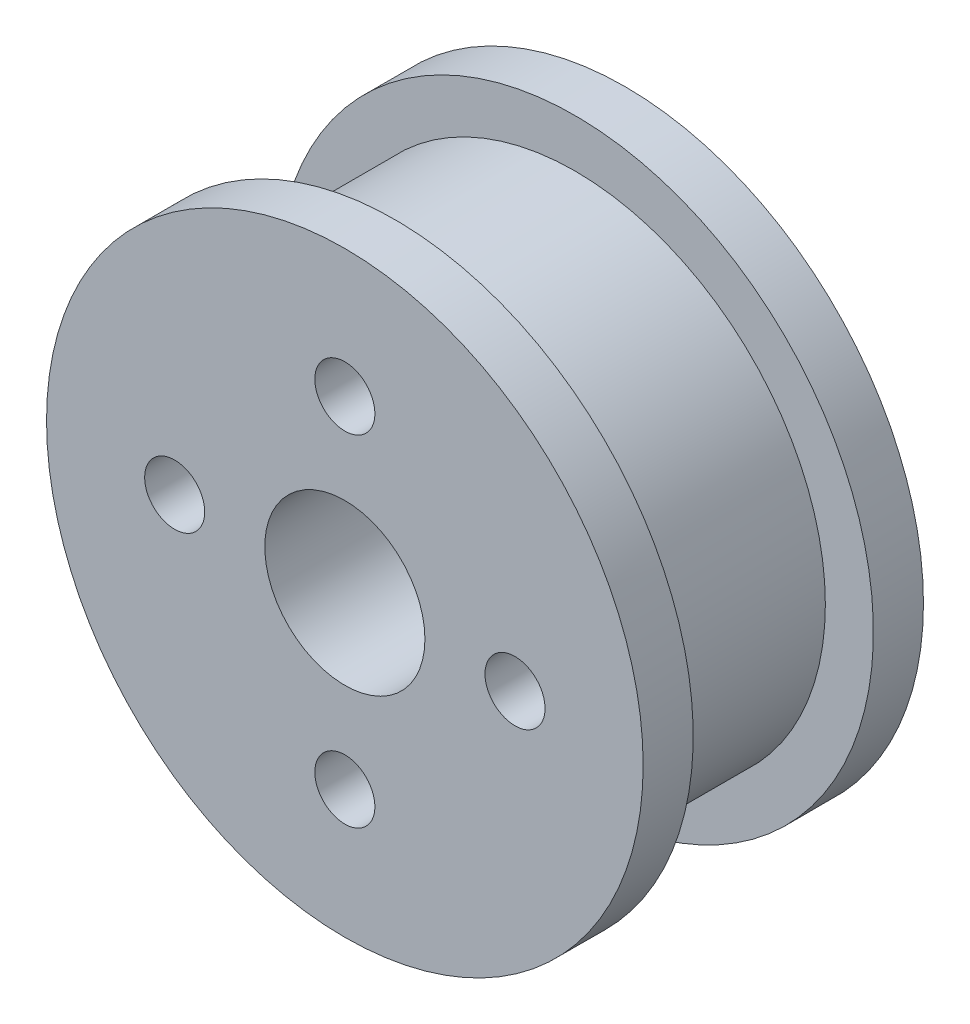
ISO-10303-21;
HEADER;
FILE_DESCRIPTION(('STEP AP214'),'2;1');
FILE_NAME('part.step','',(''),(''),'','','');
FILE_SCHEMA(('AUTOMOTIVE_DESIGN { 1 0 10303 214 1 1 1 1 }'));
ENDSEC;
DATA;
#1=APPLICATION_CONTEXT('core data for automotive mechanical design processes');
#2=APPLICATION_PROTOCOL_DEFINITION('international standard','automotive_design',2000,#1);
#3=PRODUCT_CONTEXT('',#1,'mechanical');
#4=PRODUCT('Part','Part','',(#3));
#5=PRODUCT_RELATED_PRODUCT_CATEGORY('part','',(#4));
#6=PRODUCT_DEFINITION_FORMATION('','',#4);
#7=PRODUCT_DEFINITION_CONTEXT('part definition',#1,'design');
#8=PRODUCT_DEFINITION('design','',#6,#7);
#9=PRODUCT_DEFINITION_SHAPE('','',#8);
#10=(LENGTH_UNIT() NAMED_UNIT(*) SI_UNIT(.MILLI.,.METRE.));
#11=(NAMED_UNIT(*) PLANE_ANGLE_UNIT() SI_UNIT($,.RADIAN.));
#12=(NAMED_UNIT(*) SI_UNIT($,.STERADIAN.) SOLID_ANGLE_UNIT());
#13=UNCERTAINTY_MEASURE_WITH_UNIT(LENGTH_MEASURE(1.E-05),#10,'distance_accuracy_value','');
#14=(GEOMETRIC_REPRESENTATION_CONTEXT(3) GLOBAL_UNCERTAINTY_ASSIGNED_CONTEXT((#13)) GLOBAL_UNIT_ASSIGNED_CONTEXT((#10,
#11,#12)) REPRESENTATION_CONTEXT('',''));
#15=CARTESIAN_POINT('',(0.,0.,0.));
#16=DIRECTION('',(0.,0.,1.));
#17=DIRECTION('',(1.,0.,0.));
#18=AXIS2_PLACEMENT_3D('',#15,#16,#17);
#19=CARTESIAN_POINT('',(0.,0.,14.));
#20=DIRECTION('',(0.,0.,-1.));
#21=DIRECTION('',(-1.,0.,0.));
#22=AXIS2_PLACEMENT_3D('',#19,#20,#21);
#23=CYLINDRICAL_SURFACE('',#22,14.9);
#24=CARTESIAN_POINT('',(0.,0.,14.));
#25=DIRECTION('',(0.,0.,1.));
#26=DIRECTION('',(1.,0.,0.));
#27=AXIS2_PLACEMENT_3D('',#24,#25,#26);
#28=CIRCLE('',#27,14.9);
#29=CARTESIAN_POINT('',(14.9,0.,14.));
#30=VERTEX_POINT('',#29);
#31=EDGE_CURVE('E10',#30,#30,#28,.T.);
#32=ORIENTED_EDGE('',*,*,#31,.F.);
#33=EDGE_LOOP('',(#32));
#34=FACE_BOUND('',#33,.T.);
#35=CARTESIAN_POINT('',(0.,0.,11.5));
#36=DIRECTION('',(0.,0.,-1.));
#37=DIRECTION('',(-1.,0.,0.));
#38=AXIS2_PLACEMENT_3D('',#35,#36,#37);
#39=CIRCLE('',#38,14.9);
#40=CARTESIAN_POINT('',(-14.9,0.,11.5));
#41=VERTEX_POINT('',#40);
#42=EDGE_CURVE('E53',#41,#41,#39,.T.);
#43=ORIENTED_EDGE('',*,*,#42,.F.);
#44=EDGE_LOOP('',(#43));
#45=FACE_BOUND('',#44,.T.);
#46=ADVANCED_FACE('F37',(#34,#45),#23,.T.);
#47=CARTESIAN_POINT('',(0.,0.,14.));
#48=DIRECTION('',(0.,0.,1.));
#49=DIRECTION('',(1.,0.,0.));
#50=AXIS2_PLACEMENT_3D('',#47,#48,#49);
#51=PLANE('',#50);
#52=CARTESIAN_POINT('',(0.,8.5,14.));
#53=DIRECTION('',(0.,0.,-1.));
#54=DIRECTION('',(-1.,0.,0.));
#55=AXIS2_PLACEMENT_3D('',#52,#53,#54);
#56=CIRCLE('',#55,1.5);
#57=CARTESIAN_POINT('',(-1.5,8.5,14.));
#58=VERTEX_POINT('',#57);
#59=EDGE_CURVE('E65',#58,#58,#56,.T.);
#60=ORIENTED_EDGE('',*,*,#59,.T.);
#61=EDGE_LOOP('',(#60));
#62=FACE_BOUND('',#61,.T.);
#63=CARTESIAN_POINT('',(8.5,0.,14.));
#64=DIRECTION('',(0.,0.,-1.));
#65=DIRECTION('',(-1.,0.,0.));
#66=AXIS2_PLACEMENT_3D('',#63,#64,#65);
#67=CIRCLE('',#66,1.5);
#68=CARTESIAN_POINT('',(7.,0.,14.));
#69=VERTEX_POINT('',#68);
#70=EDGE_CURVE('E83',#69,#69,#67,.T.);
#71=ORIENTED_EDGE('',*,*,#70,.T.);
#72=EDGE_LOOP('',(#71));
#73=FACE_BOUND('',#72,.T.);
#74=CARTESIAN_POINT('',(-8.5,0.,14.));
#75=DIRECTION('',(0.,0.,-1.));
#76=DIRECTION('',(-1.,0.,0.));
#77=AXIS2_PLACEMENT_3D('',#74,#75,#76);
#78=CIRCLE('',#77,1.5);
#79=CARTESIAN_POINT('',(-10.,0.,14.));
#80=VERTEX_POINT('',#79);
#81=EDGE_CURVE('E77',#80,#80,#78,.T.);
#82=ORIENTED_EDGE('',*,*,#81,.T.);
#83=EDGE_LOOP('',(#82));
#84=FACE_BOUND('',#83,.T.);
#85=CARTESIAN_POINT('',(0.,-8.5,14.));
#86=DIRECTION('',(0.,0.,-1.));
#87=DIRECTION('',(-1.,0.,0.));
#88=AXIS2_PLACEMENT_3D('',#85,#86,#87);
#89=CIRCLE('',#88,1.5);
#90=CARTESIAN_POINT('',(-1.5,-8.5,14.));
#91=VERTEX_POINT('',#90);
#92=EDGE_CURVE('E71',#91,#91,#89,.T.);
#93=ORIENTED_EDGE('',*,*,#92,.T.);
#94=EDGE_LOOP('',(#93));
#95=FACE_BOUND('',#94,.T.);
#96=ORIENTED_EDGE('',*,*,#31,.T.);
#97=EDGE_LOOP('',(#96));
#98=FACE_BOUND('',#97,.T.);
#99=CARTESIAN_POINT('',(0.,0.,14.));
#100=DIRECTION('',(0.,0.,1.));
#101=DIRECTION('',(1.,0.,0.));
#102=AXIS2_PLACEMENT_3D('',#99,#100,#101);
#103=CIRCLE('',#102,4.);
#104=CARTESIAN_POINT('',(4.,0.,14.));
#105=VERTEX_POINT('',#104);
#106=EDGE_CURVE('E48',#105,#105,#103,.T.);
#107=ORIENTED_EDGE('',*,*,#106,.F.);
#108=EDGE_LOOP('',(#107));
#109=FACE_BOUND('',#108,.T.);
#110=ADVANCED_FACE('F92',(#62,#73,#84,#95,#98,#109),#51,.T.);
#111=CARTESIAN_POINT('',(0.,0.,0.));
#112=DIRECTION('',(0.,0.,1.));
#113=DIRECTION('',(1.,0.,0.));
#114=AXIS2_PLACEMENT_3D('',#111,#112,#113);
#115=PLANE('',#114);
#116=CARTESIAN_POINT('',(0.,8.5,0.));
#117=DIRECTION('',(0.,0.,-1.));
#118=DIRECTION('',(-1.,0.,0.));
#119=AXIS2_PLACEMENT_3D('',#116,#117,#118);
#120=CIRCLE('',#119,1.5);
#121=CARTESIAN_POINT('',(-1.5,8.5,0.));
#122=VERTEX_POINT('',#121);
#123=EDGE_CURVE('E86',#122,#122,#120,.T.);
#124=ORIENTED_EDGE('',*,*,#123,.F.);
#125=EDGE_LOOP('',(#124));
#126=FACE_BOUND('',#125,.T.);
#127=CARTESIAN_POINT('',(8.5,0.,0.));
#128=DIRECTION('',(0.,0.,-1.));
#129=DIRECTION('',(-1.,0.,0.));
#130=AXIS2_PLACEMENT_3D('',#127,#128,#129);
#131=CIRCLE('',#130,1.5);
#132=CARTESIAN_POINT('',(7.,0.,0.));
#133=VERTEX_POINT('',#132);
#134=EDGE_CURVE('E80',#133,#133,#131,.T.);
#135=ORIENTED_EDGE('',*,*,#134,.F.);
#136=EDGE_LOOP('',(#135));
#137=FACE_BOUND('',#136,.T.);
#138=CARTESIAN_POINT('',(-8.5,0.,0.));
#139=DIRECTION('',(0.,0.,-1.));
#140=DIRECTION('',(-1.,0.,0.));
#141=AXIS2_PLACEMENT_3D('',#138,#139,#140);
#142=CIRCLE('',#141,1.5);
#143=CARTESIAN_POINT('',(-10.,0.,0.));
#144=VERTEX_POINT('',#143);
#145=EDGE_CURVE('E74',#144,#144,#142,.T.);
#146=ORIENTED_EDGE('',*,*,#145,.F.);
#147=EDGE_LOOP('',(#146));
#148=FACE_BOUND('',#147,.T.);
#149=CARTESIAN_POINT('',(0.,-8.5,0.));
#150=DIRECTION('',(0.,0.,-1.));
#151=DIRECTION('',(-1.,0.,0.));
#152=AXIS2_PLACEMENT_3D('',#149,#150,#151);
#153=CIRCLE('',#152,1.5);
#154=CARTESIAN_POINT('',(-1.5,-8.5,0.));
#155=VERTEX_POINT('',#154);
#156=EDGE_CURVE('E68',#155,#155,#153,.T.);
#157=ORIENTED_EDGE('',*,*,#156,.F.);
#158=EDGE_LOOP('',(#157));
#159=FACE_BOUND('',#158,.T.);
#160=CARTESIAN_POINT('',(0.,0.,0.));
#161=DIRECTION('',(0.,0.,1.));
#162=DIRECTION('',(1.,0.,0.));
#163=AXIS2_PLACEMENT_3D('',#160,#161,#162);
#164=CIRCLE('',#163,14.9);
#165=CARTESIAN_POINT('',(14.9,0.,0.));
#166=VERTEX_POINT('',#165);
#167=EDGE_CURVE('E41',#166,#166,#164,.T.);
#168=ORIENTED_EDGE('',*,*,#167,.F.);
#169=EDGE_LOOP('',(#168));
#170=FACE_BOUND('',#169,.T.);
#171=CARTESIAN_POINT('',(0.,0.,0.));
#172=DIRECTION('',(0.,0.,1.));
#173=DIRECTION('',(1.,0.,0.));
#174=AXIS2_PLACEMENT_3D('',#171,#172,#173);
#175=CIRCLE('',#174,4.);
#176=CARTESIAN_POINT('',(4.,0.,0.));
#177=VERTEX_POINT('',#176);
#178=EDGE_CURVE('E50',#177,#177,#175,.T.);
#179=ORIENTED_EDGE('',*,*,#178,.T.);
#180=EDGE_LOOP('',(#179));
#181=FACE_BOUND('',#180,.T.);
#182=ADVANCED_FACE('F102',(#126,#137,#148,#159,#170,#181),#115,.F.);
#183=CARTESIAN_POINT('',(0.,0.,2.5));
#184=DIRECTION('',(0.,0.,-1.));
#185=DIRECTION('',(-1.,0.,0.));
#186=AXIS2_PLACEMENT_3D('',#183,#184,#185);
#187=CIRCLE('',#186,14.9);
#188=CARTESIAN_POINT('',(-14.9,0.,2.5));
#189=VERTEX_POINT('',#188);
#190=EDGE_CURVE('E56',#189,#189,#187,.T.);
#191=ORIENTED_EDGE('',*,*,#190,.T.);
#192=EDGE_LOOP('',(#191));
#193=FACE_BOUND('',#192,.T.);
#194=ORIENTED_EDGE('',*,*,#167,.T.);
#195=EDGE_LOOP('',(#194));
#196=FACE_BOUND('',#195,.T.);
#197=ADVANCED_FACE('F39',(#193,#196),#23,.T.);
#198=CARTESIAN_POINT('',(0.,0.,14.));
#199=DIRECTION('',(0.,0.,-1.));
#200=DIRECTION('',(-1.,0.,0.));
#201=AXIS2_PLACEMENT_3D('',#198,#199,#200);
#202=CYLINDRICAL_SURFACE('',#201,4.);
#203=ORIENTED_EDGE('',*,*,#106,.T.);
#204=EDGE_LOOP('',(#203));
#205=FACE_BOUND('',#204,.T.);
#206=ORIENTED_EDGE('',*,*,#178,.F.);
#207=EDGE_LOOP('',(#206));
#208=FACE_BOUND('',#207,.T.);
#209=ADVANCED_FACE('F115',(#205,#208),#202,.F.);
#210=CARTESIAN_POINT('',(0.,0.,11.5));
#211=DIRECTION('',(0.,0.,-1.));
#212=DIRECTION('',(-1.,0.,0.));
#213=AXIS2_PLACEMENT_3D('',#210,#211,#212);
#214=PLANE('',#213);
#215=CARTESIAN_POINT('',(0.,0.,11.5));
#216=DIRECTION('',(0.,0.,-1.));
#217=DIRECTION('',(-1.,0.,0.));
#218=AXIS2_PLACEMENT_3D('',#215,#216,#217);
#219=CIRCLE('',#218,12.5);
#220=CARTESIAN_POINT('',(-12.5,0.,11.5));
#221=VERTEX_POINT('',#220);
#222=EDGE_CURVE('E59',#221,#221,#219,.T.);
#223=ORIENTED_EDGE('',*,*,#222,.F.);
#224=EDGE_LOOP('',(#223));
#225=FACE_BOUND('',#224,.T.);
#226=ORIENTED_EDGE('',*,*,#42,.T.);
#227=EDGE_LOOP('',(#226));
#228=FACE_BOUND('',#227,.T.);
#229=ADVANCED_FACE('F117',(#225,#228),#214,.T.);
#230=CARTESIAN_POINT('',(0.,0.,2.5));
#231=DIRECTION('',(0.,0.,-1.));
#232=DIRECTION('',(-1.,0.,0.));
#233=AXIS2_PLACEMENT_3D('',#230,#231,#232);
#234=PLANE('',#233);
#235=CARTESIAN_POINT('',(0.,0.,2.5));
#236=DIRECTION('',(0.,0.,-1.));
#237=DIRECTION('',(-1.,0.,0.));
#238=AXIS2_PLACEMENT_3D('',#235,#236,#237);
#239=CIRCLE('',#238,12.5);
#240=CARTESIAN_POINT('',(-12.5,0.,2.5));
#241=VERTEX_POINT('',#240);
#242=EDGE_CURVE('E62',#241,#241,#239,.T.);
#243=ORIENTED_EDGE('',*,*,#242,.T.);
#244=EDGE_LOOP('',(#243));
#245=FACE_BOUND('',#244,.T.);
#246=ORIENTED_EDGE('',*,*,#190,.F.);
#247=EDGE_LOOP('',(#246));
#248=FACE_BOUND('',#247,.T.);
#249=ADVANCED_FACE('F124',(#245,#248),#234,.F.);
#250=CARTESIAN_POINT('',(0.,0.,11.5));
#251=DIRECTION('',(0.,0.,-1.));
#252=DIRECTION('',(-1.,0.,0.));
#253=AXIS2_PLACEMENT_3D('',#250,#251,#252);
#254=CYLINDRICAL_SURFACE('',#253,12.5);
#255=ORIENTED_EDGE('',*,*,#222,.T.);
#256=EDGE_LOOP('',(#255));
#257=FACE_BOUND('',#256,.T.);
#258=ORIENTED_EDGE('',*,*,#242,.F.);
#259=EDGE_LOOP('',(#258));
#260=FACE_BOUND('',#259,.T.);
#261=ADVANCED_FACE('F168',(#257,#260),#254,.T.);
#262=CARTESIAN_POINT('',(0.,-8.5,14.));
#263=DIRECTION('',(0.,0.,-1.));
#264=DIRECTION('',(-1.,0.,0.));
#265=AXIS2_PLACEMENT_3D('',#262,#263,#264);
#266=CYLINDRICAL_SURFACE('',#265,1.5);
#267=ORIENTED_EDGE('',*,*,#92,.F.);
#268=EDGE_LOOP('',(#267));
#269=FACE_BOUND('',#268,.T.);
#270=ORIENTED_EDGE('',*,*,#156,.T.);
#271=EDGE_LOOP('',(#270));
#272=FACE_BOUND('',#271,.T.);
#273=ADVANCED_FACE('F177',(#269,#272),#266,.F.);
#274=CARTESIAN_POINT('',(-8.5,0.,14.));
#275=DIRECTION('',(0.,0.,-1.));
#276=DIRECTION('',(-1.,0.,0.));
#277=AXIS2_PLACEMENT_3D('',#274,#275,#276);
#278=CYLINDRICAL_SURFACE('',#277,1.5);
#279=ORIENTED_EDGE('',*,*,#81,.F.);
#280=EDGE_LOOP('',(#279));
#281=FACE_BOUND('',#280,.T.);
#282=ORIENTED_EDGE('',*,*,#145,.T.);
#283=EDGE_LOOP('',(#282));
#284=FACE_BOUND('',#283,.T.);
#285=ADVANCED_FACE('F187',(#281,#284),#278,.F.);
#286=CARTESIAN_POINT('',(8.5,0.,14.));
#287=DIRECTION('',(0.,0.,-1.));
#288=DIRECTION('',(-1.,0.,0.));
#289=AXIS2_PLACEMENT_3D('',#286,#287,#288);
#290=CYLINDRICAL_SURFACE('',#289,1.5);
#291=ORIENTED_EDGE('',*,*,#70,.F.);
#292=EDGE_LOOP('',(#291));
#293=FACE_BOUND('',#292,.T.);
#294=ORIENTED_EDGE('',*,*,#134,.T.);
#295=EDGE_LOOP('',(#294));
#296=FACE_BOUND('',#295,.T.);
#297=ADVANCED_FACE('F98',(#293,#296),#290,.F.);
#298=CARTESIAN_POINT('',(0.,8.5,14.));
#299=DIRECTION('',(0.,0.,-1.));
#300=DIRECTION('',(-1.,0.,0.));
#301=AXIS2_PLACEMENT_3D('',#298,#299,#300);
#302=CYLINDRICAL_SURFACE('',#301,1.5);
#303=ORIENTED_EDGE('',*,*,#59,.F.);
#304=EDGE_LOOP('',(#303));
#305=FACE_BOUND('',#304,.T.);
#306=ORIENTED_EDGE('',*,*,#123,.T.);
#307=EDGE_LOOP('',(#306));
#308=FACE_BOUND('',#307,.T.);
#309=ADVANCED_FACE('F95',(#305,#308),#302,.F.);
#310=CLOSED_SHELL('',(#46,#110,#182,#197,#209,#229,#249,#261,#273,#285,#297,#309));
#311=MANIFOLD_SOLID_BREP('B2',#310);
#312=ADVANCED_BREP_SHAPE_REPRESENTATION('',(#18,#311),#14);
#313=SHAPE_DEFINITION_REPRESENTATION(#9,#312);
ENDSEC;
END-ISO-10303-21;
